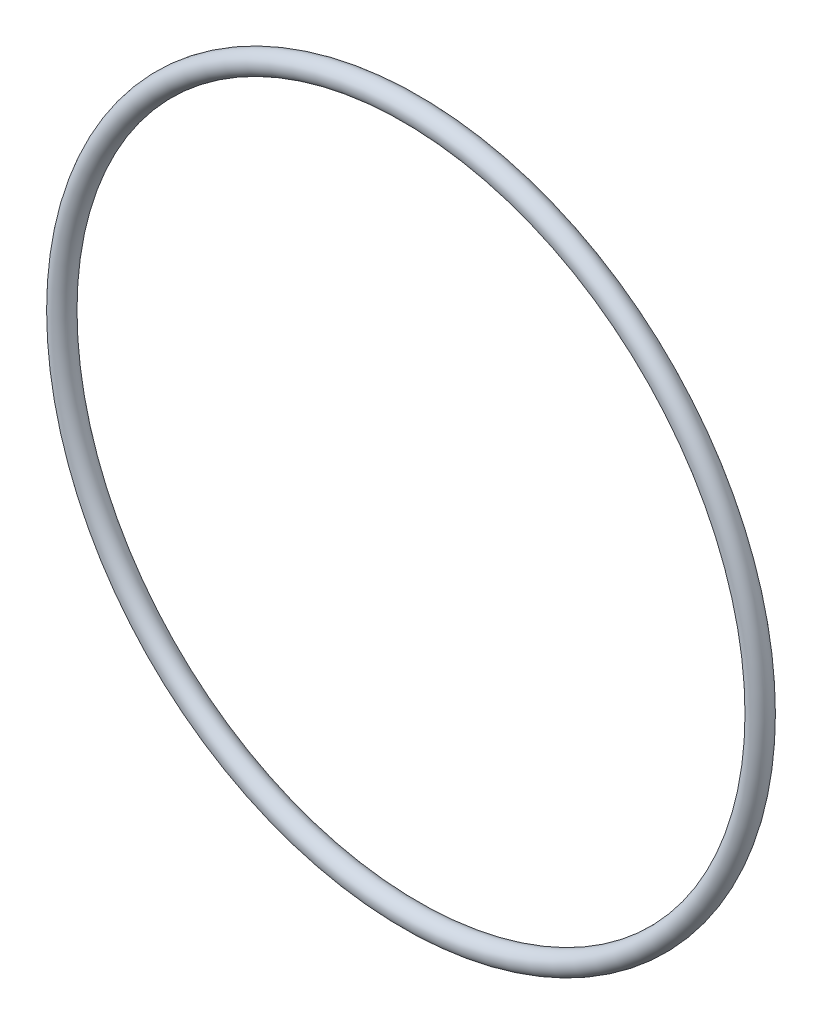
ISO-10303-21;
HEADER;
FILE_DESCRIPTION(('STEP AP214'),'2;1');
FILE_NAME('part.step','',(''),(''),'','','');
FILE_SCHEMA(('AUTOMOTIVE_DESIGN { 1 0 10303 214 1 1 1 1 }'));
ENDSEC;
DATA;
#1=APPLICATION_CONTEXT('core data for automotive mechanical design processes');
#2=APPLICATION_PROTOCOL_DEFINITION('international standard','automotive_design',2000,#1);
#3=PRODUCT_CONTEXT('',#1,'mechanical');
#4=PRODUCT('Part','Part','',(#3));
#5=PRODUCT_RELATED_PRODUCT_CATEGORY('part','',(#4));
#6=PRODUCT_DEFINITION_FORMATION('','',#4);
#7=PRODUCT_DEFINITION_CONTEXT('part definition',#1,'design');
#8=PRODUCT_DEFINITION('design','',#6,#7);
#9=PRODUCT_DEFINITION_SHAPE('','',#8);
#10=(LENGTH_UNIT() NAMED_UNIT(*) SI_UNIT(.MILLI.,.METRE.));
#11=(NAMED_UNIT(*) PLANE_ANGLE_UNIT() SI_UNIT($,.RADIAN.));
#12=(NAMED_UNIT(*) SI_UNIT($,.STERADIAN.) SOLID_ANGLE_UNIT());
#13=UNCERTAINTY_MEASURE_WITH_UNIT(LENGTH_MEASURE(1.E-05),#10,'distance_accuracy_value','');
#14=(GEOMETRIC_REPRESENTATION_CONTEXT(3) GLOBAL_UNCERTAINTY_ASSIGNED_CONTEXT((#13)) GLOBAL_UNIT_ASSIGNED_CONTEXT((#10,
#11,#12)) REPRESENTATION_CONTEXT('',''));
#15=CARTESIAN_POINT('',(0.,0.,0.));
#16=DIRECTION('',(0.,0.,1.));
#17=DIRECTION('',(1.,0.,0.));
#18=AXIS2_PLACEMENT_3D('',#15,#16,#17);
#19=CARTESIAN_POINT('',(0.,0.,0.));
#20=DIRECTION('',(0.,0.,1.));
#21=DIRECTION('',(1.,0.,0.));
#22=AXIS2_PLACEMENT_3D('',#19,#20,#21);
#23=TOROIDAL_SURFACE('',#22,48.7,1.5);
#24=CARTESIAN_POINT('',(50.2,0.,0.));
#25=VERTEX_POINT('',#24);
#26=VERTEX_LOOP('',#25);
#27=FACE_BOUND('',#26,.T.);
#28=ADVANCED_FACE('F35',(#27),#23,.T.);
#29=CLOSED_SHELL('',(#28));
#30=MANIFOLD_SOLID_BREP('B2',#29);
#31=ADVANCED_BREP_SHAPE_REPRESENTATION('',(#18,#30),#14);
#32=SHAPE_DEFINITION_REPRESENTATION(#9,#31);
ENDSEC;
END-ISO-10303-21;
